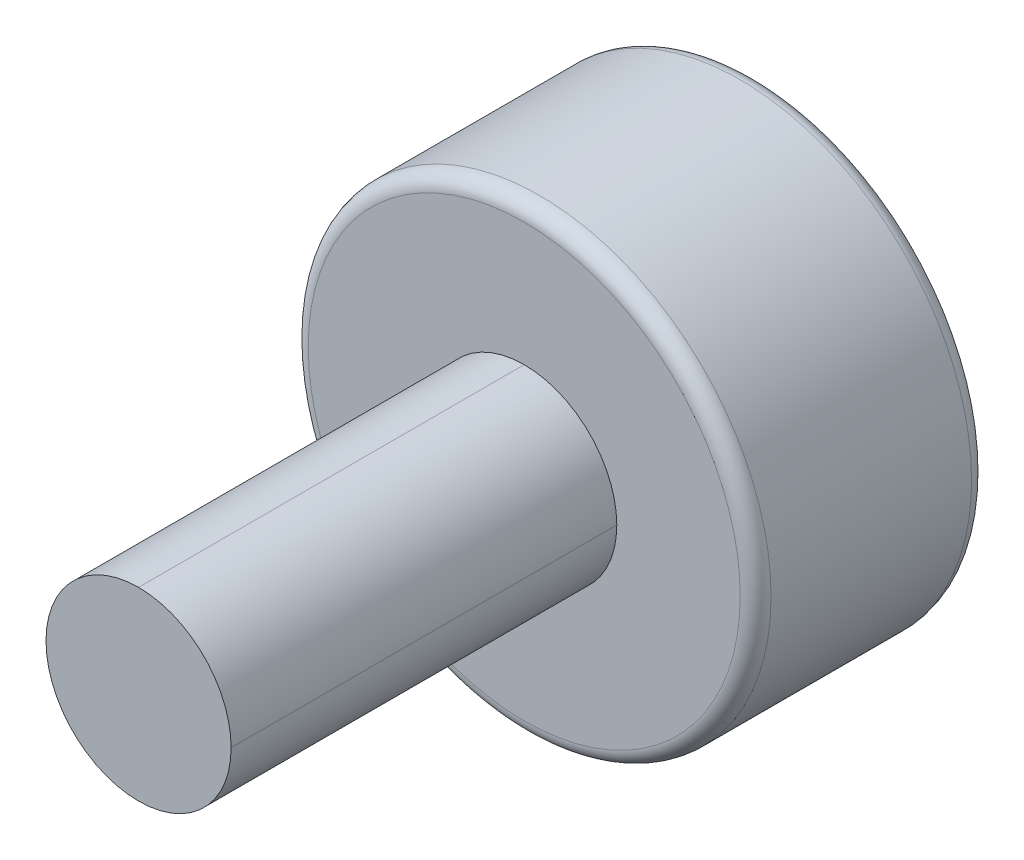
ISO-10303-21;
HEADER;
FILE_DESCRIPTION(('STEP AP214'),'2;1');
FILE_NAME('part.step','',(''),(''),'','','');
FILE_SCHEMA(('AUTOMOTIVE_DESIGN { 1 0 10303 214 1 1 1 1 }'));
ENDSEC;
DATA;
#1=APPLICATION_CONTEXT('core data for automotive mechanical design processes');
#2=APPLICATION_PROTOCOL_DEFINITION('international standard','automotive_design',2000,#1);
#3=PRODUCT_CONTEXT('',#1,'mechanical');
#4=PRODUCT('Part','Part','',(#3));
#5=PRODUCT_RELATED_PRODUCT_CATEGORY('part','',(#4));
#6=PRODUCT_DEFINITION_FORMATION('','',#4);
#7=PRODUCT_DEFINITION_CONTEXT('part definition',#1,'design');
#8=PRODUCT_DEFINITION('design','',#6,#7);
#9=PRODUCT_DEFINITION_SHAPE('','',#8);
#10=(LENGTH_UNIT() NAMED_UNIT(*) SI_UNIT(.MILLI.,.METRE.));
#11=(NAMED_UNIT(*) PLANE_ANGLE_UNIT() SI_UNIT($,.RADIAN.));
#12=(NAMED_UNIT(*) SI_UNIT($,.STERADIAN.) SOLID_ANGLE_UNIT());
#13=UNCERTAINTY_MEASURE_WITH_UNIT(LENGTH_MEASURE(1.E-05),#10,'distance_accuracy_value','');
#14=(GEOMETRIC_REPRESENTATION_CONTEXT(3) GLOBAL_UNCERTAINTY_ASSIGNED_CONTEXT((#13)) GLOBAL_UNIT_ASSIGNED_CONTEXT((#10,
#11,#12)) REPRESENTATION_CONTEXT('',''));
#15=CARTESIAN_POINT('',(0.,0.,0.));
#16=DIRECTION('',(0.,0.,1.));
#17=DIRECTION('',(1.,0.,0.));
#18=AXIS2_PLACEMENT_3D('',#15,#16,#17);
#19=CARTESIAN_POINT('',(0.,0.,50.));
#20=DIRECTION('',(0.,0.,1.));
#21=DIRECTION('',(1.,0.,0.));
#22=AXIS2_PLACEMENT_3D('',#19,#20,#21);
#23=PLANE('',#22);
#24=CARTESIAN_POINT('',(0.,0.,50.));
#25=DIRECTION('',(0.,0.,1.));
#26=DIRECTION('',(1.,0.,0.));
#27=AXIS2_PLACEMENT_3D('',#24,#25,#26);
#28=CIRCLE('',#27,12.);
#29=CARTESIAN_POINT('',(12.,0.,50.));
#30=VERTEX_POINT('',#29);
#31=CARTESIAN_POINT('',(0.,12.,50.));
#32=VERTEX_POINT('',#31);
#33=EDGE_CURVE('E100',#30,#32,#28,.T.);
#34=ORIENTED_EDGE('',*,*,#33,.T.);
#35=CARTESIAN_POINT('',(0.,0.,50.));
#36=DIRECTION('',(0.,0.,1.));
#37=DIRECTION('',(1.,0.,0.));
#38=AXIS2_PLACEMENT_3D('',#35,#36,#37);
#39=CIRCLE('',#38,12.);
#40=CARTESIAN_POINT('',(-12.,0.,50.));
#41=VERTEX_POINT('',#40);
#42=EDGE_CURVE('E84',#32,#41,#39,.T.);
#43=ORIENTED_EDGE('',*,*,#42,.T.);
#44=CARTESIAN_POINT('',(0.,0.,50.));
#45=DIRECTION('',(0.,0.,1.));
#46=DIRECTION('',(1.,0.,0.));
#47=AXIS2_PLACEMENT_3D('',#44,#45,#46);
#48=CIRCLE('',#47,12.);
#49=CARTESIAN_POINT('',(0.,-12.,50.));
#50=VERTEX_POINT('',#49);
#51=EDGE_CURVE('E91',#41,#50,#48,.T.);
#52=ORIENTED_EDGE('',*,*,#51,.T.);
#53=CARTESIAN_POINT('',(0.,0.,50.));
#54=DIRECTION('',(0.,0.,1.));
#55=DIRECTION('',(1.,0.,0.));
#56=AXIS2_PLACEMENT_3D('',#53,#54,#55);
#57=CIRCLE('',#56,12.);
#58=EDGE_CURVE('E96',#50,#30,#57,.T.);
#59=ORIENTED_EDGE('',*,*,#58,.T.);
#60=EDGE_LOOP('',(#34,#43,#52,#59));
#61=FACE_BOUND('',#60,.T.);
#62=ADVANCED_FACE('F39',(#61),#23,.T.);
#63=CARTESIAN_POINT('',(0.,0.,0.));
#64=DIRECTION('',(0.,0.,1.));
#65=DIRECTION('',(1.,0.,0.));
#66=AXIS2_PLACEMENT_3D('',#63,#64,#65);
#67=PLANE('',#66);
#68=CARTESIAN_POINT('',(0.,0.,0.));
#69=DIRECTION('',(0.,0.,1.));
#70=DIRECTION('',(1.,0.,0.));
#71=AXIS2_PLACEMENT_3D('',#68,#69,#70);
#72=CIRCLE('',#71,12.);
#73=CARTESIAN_POINT('',(12.,0.,0.));
#74=VERTEX_POINT('',#73);
#75=CARTESIAN_POINT('',(0.,-12.,0.));
#76=VERTEX_POINT('',#75);
#77=EDGE_CURVE('E48',#74,#76,#72,.F.);
#78=ORIENTED_EDGE('',*,*,#77,.T.);
#79=CARTESIAN_POINT('',(0.,0.,0.));
#80=DIRECTION('',(0.,0.,1.));
#81=DIRECTION('',(1.,0.,0.));
#82=AXIS2_PLACEMENT_3D('',#79,#80,#81);
#83=CIRCLE('',#82,12.);
#84=CARTESIAN_POINT('',(-12.,0.,0.));
#85=VERTEX_POINT('',#84);
#86=EDGE_CURVE('E11',#76,#85,#83,.F.);
#87=ORIENTED_EDGE('',*,*,#86,.T.);
#88=CARTESIAN_POINT('',(0.,0.,0.));
#89=DIRECTION('',(0.,0.,1.));
#90=DIRECTION('',(1.,0.,0.));
#91=AXIS2_PLACEMENT_3D('',#88,#89,#90);
#92=CIRCLE('',#91,12.);
#93=CARTESIAN_POINT('',(0.,12.,0.));
#94=VERTEX_POINT('',#93);
#95=EDGE_CURVE('E85',#85,#94,#92,.F.);
#96=ORIENTED_EDGE('',*,*,#95,.T.);
#97=CARTESIAN_POINT('',(0.,0.,0.));
#98=DIRECTION('',(0.,0.,1.));
#99=DIRECTION('',(1.,0.,0.));
#100=AXIS2_PLACEMENT_3D('',#97,#98,#99);
#101=CIRCLE('',#100,12.);
#102=EDGE_CURVE('E59',#94,#74,#101,.F.);
#103=ORIENTED_EDGE('',*,*,#102,.T.);
#104=EDGE_LOOP('',(#78,#87,#96,#103));
#105=FACE_BOUND('',#104,.T.);
#106=CARTESIAN_POINT('',(0.,0.,0.));
#107=DIRECTION('',(0.,0.,1.));
#108=DIRECTION('',(1.,0.,0.));
#109=AXIS2_PLACEMENT_3D('',#106,#107,#108);
#110=CIRCLE('',#109,28.);
#111=CARTESIAN_POINT('',(28.,0.,0.));
#112=VERTEX_POINT('',#111);
#113=EDGE_CURVE('E119',#112,#112,#110,.T.);
#114=ORIENTED_EDGE('',*,*,#113,.T.);
#115=EDGE_LOOP('',(#114));
#116=FACE_BOUND('',#115,.T.);
#117=ADVANCED_FACE('F127',(#105,#116),#67,.T.);
#118=CARTESIAN_POINT('',(0.,0.,-30.));
#119=DIRECTION('',(0.,0.,1.));
#120=DIRECTION('',(1.,0.,0.));
#121=AXIS2_PLACEMENT_3D('',#118,#119,#120);
#122=CYLINDRICAL_SURFACE('',#121,30.);
#123=CARTESIAN_POINT('',(0.,0.,-2.));
#124=DIRECTION('',(0.,0.,1.));
#125=DIRECTION('',(1.,0.,0.));
#126=AXIS2_PLACEMENT_3D('',#123,#124,#125);
#127=CIRCLE('',#126,30.);
#128=CARTESIAN_POINT('',(30.,0.,-2.));
#129=VERTEX_POINT('',#128);
#130=EDGE_CURVE('E97',#129,#129,#127,.F.);
#131=ORIENTED_EDGE('',*,*,#130,.T.);
#132=EDGE_LOOP('',(#131));
#133=FACE_BOUND('',#132,.T.);
#134=CARTESIAN_POINT('',(0.,0.,-28.));
#135=DIRECTION('',(0.,0.,1.));
#136=DIRECTION('',(1.,0.,0.));
#137=AXIS2_PLACEMENT_3D('',#134,#135,#136);
#138=CIRCLE('',#137,30.);
#139=CARTESIAN_POINT('',(30.,0.,-28.));
#140=VERTEX_POINT('',#139);
#141=EDGE_CURVE('E110',#140,#140,#138,.T.);
#142=ORIENTED_EDGE('',*,*,#141,.T.);
#143=EDGE_LOOP('',(#142));
#144=FACE_BOUND('',#143,.T.);
#145=ADVANCED_FACE('F130',(#133,#144),#122,.T.);
#146=CARTESIAN_POINT('',(0.,0.,-30.));
#147=DIRECTION('',(0.,0.,1.));
#148=DIRECTION('',(1.,0.,0.));
#149=AXIS2_PLACEMENT_3D('',#146,#147,#148);
#150=PLANE('',#149);
#151=CARTESIAN_POINT('',(0.,0.,-30.));
#152=DIRECTION('',(0.,0.,1.));
#153=DIRECTION('',(1.,0.,0.));
#154=AXIS2_PLACEMENT_3D('',#151,#152,#153);
#155=CIRCLE('',#154,28.);
#156=CARTESIAN_POINT('',(28.,0.,-30.));
#157=VERTEX_POINT('',#156);
#158=EDGE_CURVE('E114',#157,#157,#155,.F.);
#159=ORIENTED_EDGE('',*,*,#158,.T.);
#160=EDGE_LOOP('',(#159));
#161=FACE_BOUND('',#160,.T.);
#162=ADVANCED_FACE('F143',(#161),#150,.F.);
#163=CARTESIAN_POINT('',(0.,0.,-28.));
#164=DIRECTION('',(0.,0.,1.));
#165=DIRECTION('',(1.,0.,0.));
#166=AXIS2_PLACEMENT_3D('',#163,#164,#165);
#167=TOROIDAL_SURFACE('',#166,28.,2.);
#168=ORIENTED_EDGE('',*,*,#158,.F.);
#169=EDGE_LOOP('',(#168));
#170=FACE_BOUND('',#169,.T.);
#171=ORIENTED_EDGE('',*,*,#141,.F.);
#172=EDGE_LOOP('',(#171));
#173=FACE_BOUND('',#172,.T.);
#174=ADVANCED_FACE('F136',(#170,#173),#167,.T.);
#175=CARTESIAN_POINT('',(0.,0.,-2.));
#176=DIRECTION('',(0.,0.,1.));
#177=DIRECTION('',(1.,0.,0.));
#178=AXIS2_PLACEMENT_3D('',#175,#176,#177);
#179=TOROIDAL_SURFACE('',#178,28.,2.);
#180=ORIENTED_EDGE('',*,*,#130,.F.);
#181=EDGE_LOOP('',(#180));
#182=FACE_BOUND('',#181,.T.);
#183=ORIENTED_EDGE('',*,*,#113,.F.);
#184=EDGE_LOOP('',(#183));
#185=FACE_BOUND('',#184,.T.);
#186=ADVANCED_FACE('F134',(#182,#185),#179,.T.);
#187=CARTESIAN_POINT('',(0.,0.,50.));
#188=DIRECTION('',(0.,0.,-1.));
#189=DIRECTION('',(-1.,0.,0.));
#190=AXIS2_PLACEMENT_3D('',#187,#188,#189);
#191=CYLINDRICAL_SURFACE('',#190,12.);
#192=DIRECTION('',(0.,0.,-1.));
#193=VECTOR('',#192,1.);
#194=CARTESIAN_POINT('',(0.,-12.,50.));
#195=LINE('',#194,#193);
#196=EDGE_CURVE('E93',#76,#50,#195,.F.);
#197=ORIENTED_EDGE('',*,*,#196,.F.);
#198=ORIENTED_EDGE('',*,*,#77,.F.);
#199=DIRECTION('',(0.,0.,-1.));
#200=VECTOR('',#199,1.);
#201=CARTESIAN_POINT('',(12.,0.,50.));
#202=LINE('',#201,#200);
#203=EDGE_CURVE('E43',#30,#74,#202,.T.);
#204=ORIENTED_EDGE('',*,*,#203,.F.);
#205=ORIENTED_EDGE('',*,*,#58,.F.);
#206=EDGE_LOOP('',(#197,#198,#204,#205));
#207=FACE_BOUND('',#206,.T.);
#208=ADVANCED_FACE('F41',(#207),#191,.T.);
#209=CARTESIAN_POINT('',(0.,0.,50.));
#210=DIRECTION('',(0.,0.,-1.));
#211=DIRECTION('',(-1.,0.,0.));
#212=AXIS2_PLACEMENT_3D('',#209,#210,#211);
#213=CYLINDRICAL_SURFACE('',#212,12.);
#214=ORIENTED_EDGE('',*,*,#203,.T.);
#215=ORIENTED_EDGE('',*,*,#102,.F.);
#216=DIRECTION('',(0.,0.,-1.));
#217=VECTOR('',#216,1.);
#218=CARTESIAN_POINT('',(0.,12.,50.));
#219=LINE('',#218,#217);
#220=EDGE_CURVE('E88',#32,#94,#219,.T.);
#221=ORIENTED_EDGE('',*,*,#220,.F.);
#222=ORIENTED_EDGE('',*,*,#33,.F.);
#223=EDGE_LOOP('',(#214,#215,#221,#222));
#224=FACE_BOUND('',#223,.T.);
#225=ADVANCED_FACE('F126',(#224),#213,.T.);
#226=CARTESIAN_POINT('',(0.,0.,50.));
#227=DIRECTION('',(0.,0.,-1.));
#228=DIRECTION('',(-1.,0.,0.));
#229=AXIS2_PLACEMENT_3D('',#226,#227,#228);
#230=CYLINDRICAL_SURFACE('',#229,12.);
#231=ORIENTED_EDGE('',*,*,#196,.T.);
#232=ORIENTED_EDGE('',*,*,#51,.F.);
#233=DIRECTION('',(0.,0.,-1.));
#234=VECTOR('',#233,1.);
#235=CARTESIAN_POINT('',(-12.,0.,50.));
#236=LINE('',#235,#234);
#237=EDGE_CURVE('E80',#85,#41,#236,.F.);
#238=ORIENTED_EDGE('',*,*,#237,.F.);
#239=ORIENTED_EDGE('',*,*,#86,.F.);
#240=EDGE_LOOP('',(#231,#232,#238,#239));
#241=FACE_BOUND('',#240,.T.);
#242=ADVANCED_FACE('F92',(#241),#230,.T.);
#243=CARTESIAN_POINT('',(0.,0.,50.));
#244=DIRECTION('',(0.,0.,-1.));
#245=DIRECTION('',(-1.,0.,0.));
#246=AXIS2_PLACEMENT_3D('',#243,#244,#245);
#247=CYLINDRICAL_SURFACE('',#246,12.);
#248=ORIENTED_EDGE('',*,*,#42,.F.);
#249=ORIENTED_EDGE('',*,*,#220,.T.);
#250=ORIENTED_EDGE('',*,*,#95,.F.);
#251=ORIENTED_EDGE('',*,*,#237,.T.);
#252=EDGE_LOOP('',(#248,#249,#250,#251));
#253=FACE_BOUND('',#252,.T.);
#254=ADVANCED_FACE('F82',(#253),#247,.T.);
#255=CLOSED_SHELL('',(#62,#117,#145,#162,#174,#186,#208,#225,#242,#254));
#256=MANIFOLD_SOLID_BREP('B2',#255);
#257=ADVANCED_BREP_SHAPE_REPRESENTATION('',(#18,#256),#14);
#258=SHAPE_DEFINITION_REPRESENTATION(#9,#257);
ENDSEC;
END-ISO-10303-21;
